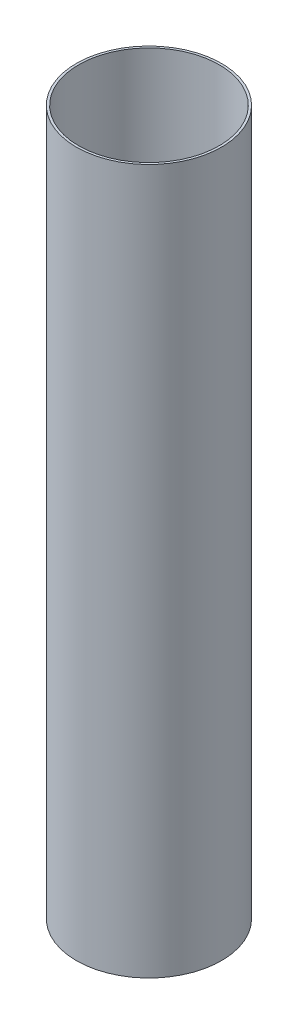
ISO-10303-21;
HEADER;
FILE_DESCRIPTION(('STEP AP214'),'2;1');
FILE_NAME('part.step','',(''),(''),'','','');
FILE_SCHEMA(('AUTOMOTIVE_DESIGN { 1 0 10303 214 1 1 1 1 }'));
ENDSEC;
DATA;
#1=APPLICATION_CONTEXT('core data for automotive mechanical design processes');
#2=APPLICATION_PROTOCOL_DEFINITION('international standard','automotive_design',2000,#1);
#3=PRODUCT_CONTEXT('',#1,'mechanical');
#4=PRODUCT('Part','Part','',(#3));
#5=PRODUCT_RELATED_PRODUCT_CATEGORY('part','',(#4));
#6=PRODUCT_DEFINITION_FORMATION('','',#4);
#7=PRODUCT_DEFINITION_CONTEXT('part definition',#1,'design');
#8=PRODUCT_DEFINITION('design','',#6,#7);
#9=PRODUCT_DEFINITION_SHAPE('','',#8);
#10=(LENGTH_UNIT() NAMED_UNIT(*) SI_UNIT(.MILLI.,.METRE.));
#11=(NAMED_UNIT(*) PLANE_ANGLE_UNIT() SI_UNIT($,.RADIAN.));
#12=(NAMED_UNIT(*) SI_UNIT($,.STERADIAN.) SOLID_ANGLE_UNIT());
#13=UNCERTAINTY_MEASURE_WITH_UNIT(LENGTH_MEASURE(1.E-05),#10,'distance_accuracy_value','');
#14=(GEOMETRIC_REPRESENTATION_CONTEXT(3) GLOBAL_UNCERTAINTY_ASSIGNED_CONTEXT((#13)) GLOBAL_UNIT_ASSIGNED_CONTEXT((#10,
#11,#12)) REPRESENTATION_CONTEXT('',''));
#15=CARTESIAN_POINT('',(0.,0.,0.));
#16=DIRECTION('',(0.,0.,1.));
#17=DIRECTION('',(1.,0.,0.));
#18=AXIS2_PLACEMENT_3D('',#15,#16,#17);
#19=CARTESIAN_POINT('',(0.,762.,0.));
#20=DIRECTION('',(0.,1.,0.));
#21=DIRECTION('',(0.,0.,1.));
#22=AXIS2_PLACEMENT_3D('',#19,#20,#21);
#23=PLANE('',#22);
#24=CARTESIAN_POINT('',(0.,762.,0.));
#25=DIRECTION('',(0.,1.,0.));
#26=DIRECTION('',(0.,0.,1.));
#27=AXIS2_PLACEMENT_3D('',#24,#25,#26);
#28=CIRCLE('',#27,78.5);
#29=CARTESIAN_POINT('',(0.,762.,78.5));
#30=VERTEX_POINT('',#29);
#31=EDGE_CURVE('E10',#30,#30,#28,.T.);
#32=ORIENTED_EDGE('',*,*,#31,.T.);
#33=EDGE_LOOP('',(#32));
#34=FACE_BOUND('',#33,.T.);
#35=CARTESIAN_POINT('',(0.,762.,0.));
#36=DIRECTION('',(0.,1.,0.));
#37=DIRECTION('',(0.,0.,1.));
#38=AXIS2_PLACEMENT_3D('',#35,#36,#37);
#39=CIRCLE('',#38,76.);
#40=CARTESIAN_POINT('',(0.,762.,76.));
#41=VERTEX_POINT('',#40);
#42=EDGE_CURVE('E56',#41,#41,#39,.T.);
#43=ORIENTED_EDGE('',*,*,#42,.F.);
#44=EDGE_LOOP('',(#43));
#45=FACE_BOUND('',#44,.T.);
#46=ADVANCED_FACE('F43',(#34,#45),#23,.T.);
#47=CARTESIAN_POINT('',(0.,0.,0.));
#48=DIRECTION('',(0.,1.,0.));
#49=DIRECTION('',(0.,0.,1.));
#50=AXIS2_PLACEMENT_3D('',#47,#48,#49);
#51=PLANE('',#50);
#52=CARTESIAN_POINT('',(0.,0.,0.));
#53=DIRECTION('',(0.,1.,0.));
#54=DIRECTION('',(0.,0.,1.));
#55=AXIS2_PLACEMENT_3D('',#52,#53,#54);
#56=CIRCLE('',#55,78.5);
#57=CARTESIAN_POINT('',(0.,0.,78.5));
#58=VERTEX_POINT('',#57);
#59=EDGE_CURVE('E47',#58,#58,#56,.T.);
#60=ORIENTED_EDGE('',*,*,#59,.F.);
#61=EDGE_LOOP('',(#60));
#62=FACE_BOUND('',#61,.T.);
#63=CARTESIAN_POINT('',(0.,0.,0.));
#64=DIRECTION('',(0.,1.,0.));
#65=DIRECTION('',(0.,0.,1.));
#66=AXIS2_PLACEMENT_3D('',#63,#64,#65);
#67=CIRCLE('',#66,76.);
#68=CARTESIAN_POINT('',(0.,0.,76.));
#69=VERTEX_POINT('',#68);
#70=EDGE_CURVE('E58',#69,#69,#67,.T.);
#71=ORIENTED_EDGE('',*,*,#70,.T.);
#72=EDGE_LOOP('',(#71));
#73=FACE_BOUND('',#72,.T.);
#74=ADVANCED_FACE('F70',(#62,#73),#51,.F.);
#75=CARTESIAN_POINT('',(0.,762.,0.));
#76=DIRECTION('',(0.,-1.,0.));
#77=DIRECTION('',(0.,0.,-1.));
#78=AXIS2_PLACEMENT_3D('',#75,#76,#77);
#79=CYLINDRICAL_SURFACE('',#78,78.5);
#80=ORIENTED_EDGE('',*,*,#31,.F.);
#81=EDGE_LOOP('',(#80));
#82=FACE_BOUND('',#81,.T.);
#83=ORIENTED_EDGE('',*,*,#59,.T.);
#84=EDGE_LOOP('',(#83));
#85=FACE_BOUND('',#84,.T.);
#86=ADVANCED_FACE('F45',(#82,#85),#79,.T.);
#87=CARTESIAN_POINT('',(0.,762.,0.));
#88=DIRECTION('',(0.,-1.,0.));
#89=DIRECTION('',(0.,0.,-1.));
#90=AXIS2_PLACEMENT_3D('',#87,#88,#89);
#91=CYLINDRICAL_SURFACE('',#90,76.);
#92=ORIENTED_EDGE('',*,*,#42,.T.);
#93=EDGE_LOOP('',(#92));
#94=FACE_BOUND('',#93,.T.);
#95=ORIENTED_EDGE('',*,*,#70,.F.);
#96=EDGE_LOOP('',(#95));
#97=FACE_BOUND('',#96,.T.);
#98=ADVANCED_FACE('F66',(#94,#97),#91,.F.);
#99=CLOSED_SHELL('',(#46,#74,#86,#98));
#100=MANIFOLD_SOLID_BREP('B2',#99);
#101=ADVANCED_BREP_SHAPE_REPRESENTATION('',(#18,#100),#14);
#102=SHAPE_DEFINITION_REPRESENTATION(#9,#101);
ENDSEC;
END-ISO-10303-21;
